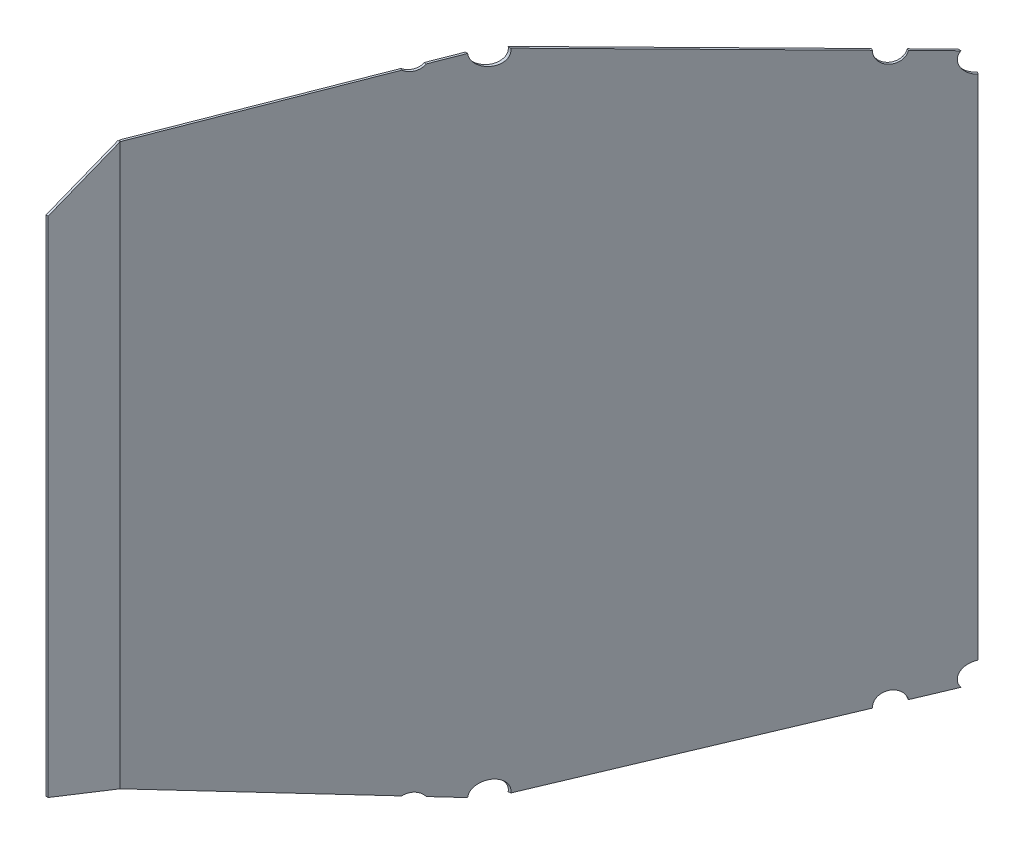
ISO-10303-21;
HEADER;
FILE_DESCRIPTION(('STEP AP214'),'2;1');
FILE_NAME('part.step','',(''),(''),'','','');
FILE_SCHEMA(('AUTOMOTIVE_DESIGN { 1 0 10303 214 1 1 1 1 }'));
ENDSEC;
DATA;
#1=APPLICATION_CONTEXT('core data for automotive mechanical design processes');
#2=APPLICATION_PROTOCOL_DEFINITION('international standard','automotive_design',2000,#1);
#3=PRODUCT_CONTEXT('',#1,'mechanical');
#4=PRODUCT('Part','Part','',(#3));
#5=PRODUCT_RELATED_PRODUCT_CATEGORY('part','',(#4));
#6=PRODUCT_DEFINITION_FORMATION('','',#4);
#7=PRODUCT_DEFINITION_CONTEXT('part definition',#1,'design');
#8=PRODUCT_DEFINITION('design','',#6,#7);
#9=PRODUCT_DEFINITION_SHAPE('','',#8);
#10=(LENGTH_UNIT() NAMED_UNIT(*) SI_UNIT(.MILLI.,.METRE.));
#11=(NAMED_UNIT(*) PLANE_ANGLE_UNIT() SI_UNIT($,.RADIAN.));
#12=(NAMED_UNIT(*) SI_UNIT($,.STERADIAN.) SOLID_ANGLE_UNIT());
#13=UNCERTAINTY_MEASURE_WITH_UNIT(LENGTH_MEASURE(1.E-05),#10,'distance_accuracy_value','');
#14=(GEOMETRIC_REPRESENTATION_CONTEXT(3) GLOBAL_UNCERTAINTY_ASSIGNED_CONTEXT((#13)) GLOBAL_UNIT_ASSIGNED_CONTEXT((#10,
#11,#12)) REPRESENTATION_CONTEXT('',''));
#15=CARTESIAN_POINT('',(0.,0.,0.));
#16=DIRECTION('',(0.,0.,1.));
#17=DIRECTION('',(1.,0.,0.));
#18=AXIS2_PLACEMENT_3D('',#15,#16,#17);
#19=CARTESIAN_POINT('',(10.5410000000001,0.,525.07591607291));
#20=DIRECTION('',(0.,0.,-1.));
#21=DIRECTION('',(-1.,0.,0.));
#22=AXIS2_PLACEMENT_3D('',#19,#20,#21);
#23=PLANE('',#22);
#24=DIRECTION('',(0.,1.,0.));
#25=VECTOR('',#24,1.);
#26=CARTESIAN_POINT('',(12.7000000000001,0.,525.07591607291));
#27=LINE('',#26,#25);
#28=CARTESIAN_POINT('',(12.7000000000001,-279.4,525.07591607291));
#29=VERTEX_POINT('',#28);
#30=CARTESIAN_POINT('',(12.7000000000001,279.4,525.07591607291));
#31=VERTEX_POINT('',#30);
#32=EDGE_CURVE('E122',#29,#31,#27,.T.);
#33=ORIENTED_EDGE('',*,*,#32,.F.);
#34=DIRECTION('',(1.,0.,0.));
#35=VECTOR('',#34,1.);
#36=CARTESIAN_POINT('',(10.5410000000001,-279.4,525.07591607291));
#37=LINE('',#36,#35);
#38=CARTESIAN_POINT('',(10.5410000000001,-279.4,525.07591607291));
#39=VERTEX_POINT('',#38);
#40=EDGE_CURVE('E12',#39,#29,#37,.T.);
#41=ORIENTED_EDGE('',*,*,#40,.F.);
#42=DIRECTION('',(0.,1.,0.));
#43=VECTOR('',#42,1.);
#44=CARTESIAN_POINT('',(10.5410000000001,0.,525.07591607291));
#45=LINE('',#44,#43);
#46=CARTESIAN_POINT('',(10.5410000000001,279.4,525.07591607291));
#47=VERTEX_POINT('',#46);
#48=EDGE_CURVE('E107',#39,#47,#45,.T.);
#49=ORIENTED_EDGE('',*,*,#48,.T.);
#50=DIRECTION('',(1.,0.,0.));
#51=VECTOR('',#50,1.);
#52=CARTESIAN_POINT('',(10.5410000000001,279.4,525.07591607291));
#53=LINE('',#52,#51);
#54=EDGE_CURVE('E75',#47,#31,#53,.T.);
#55=ORIENTED_EDGE('',*,*,#54,.T.);
#56=EDGE_LOOP('',(#33,#41,#49,#55));
#57=FACE_BOUND('',#56,.T.);
#58=ADVANCED_FACE('F59',(#57),#23,.T.);
#59=CARTESIAN_POINT('',(10.5410000000001,-421.142218376144,166.451813741526));
#60=DIRECTION('',(0.,0.929995652978715,-0.367570517643477));
#61=DIRECTION('',(0.,0.367570517643477,0.929995652978715));
#62=AXIS2_PLACEMENT_3D('',#59,#60,#61);
#63=PLANE('',#62);
#64=DIRECTION('',(0.,0.367570517643477,0.929995652978715));
#65=VECTOR('',#64,1.);
#66=CARTESIAN_POINT('',(12.7000000000001,-421.142218376144,166.451813741526));
#67=LINE('',#66,#65);
#68=CARTESIAN_POINT('',(12.7000000000001,-251.012323537438,596.9));
#69=VERTEX_POINT('',#68);
#70=EDGE_CURVE('E113',#29,#69,#67,.T.);
#71=ORIENTED_EDGE('',*,*,#70,.T.);
#72=DIRECTION('',(1.,0.,0.));
#73=VECTOR('',#72,1.);
#74=CARTESIAN_POINT('',(10.5410000000001,-251.012323537438,596.9));
#75=LINE('',#74,#73);
#76=CARTESIAN_POINT('',(10.5410000000001,-251.012323537438,596.9));
#77=VERTEX_POINT('',#76);
#78=EDGE_CURVE('E67',#77,#69,#75,.T.);
#79=ORIENTED_EDGE('',*,*,#78,.F.);
#80=DIRECTION('',(0.,0.367570517643477,0.929995652978715));
#81=VECTOR('',#80,1.);
#82=CARTESIAN_POINT('',(10.5410000000001,-421.142218376144,166.451813741526));
#83=LINE('',#82,#81);
#84=EDGE_CURVE('E101',#39,#77,#83,.T.);
#85=ORIENTED_EDGE('',*,*,#84,.F.);
#86=ORIENTED_EDGE('',*,*,#40,.T.);
#87=EDGE_LOOP('',(#71,#79,#85,#86));
#88=FACE_BOUND('',#87,.T.);
#89=ADVANCED_FACE('F111',(#88),#63,.F.);
#90=CARTESIAN_POINT('',(10.5410000000001,0.,596.9));
#91=DIRECTION('',(0.,0.,1.));
#92=DIRECTION('',(1.,0.,0.));
#93=AXIS2_PLACEMENT_3D('',#90,#91,#92);
#94=PLANE('',#93);
#95=DIRECTION('',(0.,-1.,0.));
#96=VECTOR('',#95,1.);
#97=CARTESIAN_POINT('',(12.7000000000001,0.,596.9));
#98=LINE('',#97,#96);
#99=CARTESIAN_POINT('',(12.7000000000001,251.012323537438,596.9));
#100=VERTEX_POINT('',#99);
#101=EDGE_CURVE('E125',#100,#69,#98,.T.);
#102=ORIENTED_EDGE('',*,*,#101,.F.);
#103=DIRECTION('',(1.,0.,0.));
#104=VECTOR('',#103,1.);
#105=CARTESIAN_POINT('',(10.5410000000001,251.012323537438,596.9));
#106=LINE('',#105,#104);
#107=CARTESIAN_POINT('',(10.5410000000001,251.012323537438,596.9));
#108=VERTEX_POINT('',#107);
#109=EDGE_CURVE('E88',#108,#100,#106,.T.);
#110=ORIENTED_EDGE('',*,*,#109,.F.);
#111=DIRECTION('',(0.,-1.,0.));
#112=VECTOR('',#111,1.);
#113=CARTESIAN_POINT('',(10.5410000000001,0.,596.9));
#114=LINE('',#113,#112);
#115=EDGE_CURVE('E106',#108,#77,#114,.T.);
#116=ORIENTED_EDGE('',*,*,#115,.T.);
#117=ORIENTED_EDGE('',*,*,#78,.T.);
#118=EDGE_LOOP('',(#102,#110,#116,#117));
#119=FACE_BOUND('',#118,.T.);
#120=ADVANCED_FACE('F116',(#119),#94,.T.);
#121=CARTESIAN_POINT('',(10.5410000000001,421.142218376144,166.451813741526));
#122=DIRECTION('',(0.,0.929995652978715,0.367570517643477));
#123=DIRECTION('',(0.,-0.367570517643477,0.929995652978715));
#124=AXIS2_PLACEMENT_3D('',#121,#122,#123);
#125=PLANE('',#124);
#126=DIRECTION('',(0.,-0.367570517643477,0.929995652978715));
#127=VECTOR('',#126,1.);
#128=CARTESIAN_POINT('',(12.7000000000001,421.142218376144,166.451813741526));
#129=LINE('',#128,#127);
#130=EDGE_CURVE('E127',#31,#100,#129,.T.);
#131=ORIENTED_EDGE('',*,*,#130,.F.);
#132=ORIENTED_EDGE('',*,*,#54,.F.);
#133=DIRECTION('',(0.,-0.367570517643477,0.929995652978715));
#134=VECTOR('',#133,1.);
#135=CARTESIAN_POINT('',(10.5410000000001,421.142218376144,166.451813741526));
#136=LINE('',#135,#134);
#137=EDGE_CURVE('E117',#47,#108,#136,.T.);
#138=ORIENTED_EDGE('',*,*,#137,.T.);
#139=ORIENTED_EDGE('',*,*,#109,.T.);
#140=EDGE_LOOP('',(#131,#132,#138,#139));
#141=FACE_BOUND('',#140,.T.);
#142=ADVANCED_FACE('F132',(#141),#125,.T.);
#143=CARTESIAN_POINT('',(10.5410000000001,0.,0.));
#144=DIRECTION('',(-1.,0.,0.));
#145=DIRECTION('',(0.,0.,1.));
#146=AXIS2_PLACEMENT_3D('',#143,#144,#145);
#147=PLANE('',#146);
#148=ORIENTED_EDGE('',*,*,#48,.F.);
#149=ORIENTED_EDGE('',*,*,#84,.T.);
#150=ORIENTED_EDGE('',*,*,#115,.F.);
#151=ORIENTED_EDGE('',*,*,#137,.F.);
#152=EDGE_LOOP('',(#148,#149,#150,#151));
#153=FACE_BOUND('',#152,.T.);
#154=ADVANCED_FACE('F103',(#153),#147,.T.);
#155=CARTESIAN_POINT('',(12.7000000000001,0.,0.));
#156=DIRECTION('',(-1.,0.,0.));
#157=DIRECTION('',(0.,0.,1.));
#158=AXIS2_PLACEMENT_3D('',#155,#156,#157);
#159=PLANE('',#158);
#160=ORIENTED_EDGE('',*,*,#32,.T.);
#161=ORIENTED_EDGE('',*,*,#130,.T.);
#162=ORIENTED_EDGE('',*,*,#101,.T.);
#163=ORIENTED_EDGE('',*,*,#70,.F.);
#164=EDGE_LOOP('',(#160,#161,#162,#163));
#165=FACE_BOUND('',#164,.T.);
#166=ADVANCED_FACE('F139',(#165),#159,.F.);
#167=CLOSED_SHELL('',(#58,#89,#120,#142,#154,#166));
#168=MANIFOLD_SOLID_BREP('B2',#167);
#169=CARTESIAN_POINT('',(217.78075440518,-341.812437501323,214.772548142192));
#170=DIRECTION('',(-0.0920442080609493,-0.986211904406888,0.137527973040296));
#171=DIRECTION('',(0.,-0.138114278991666,-0.990416299309847));
#172=AXIS2_PLACEMENT_3D('',#169,#170,#171);
#173=PLANE('',#172);
#174=CARTESIAN_POINT('',(180.084004303636,-316.675903331611,369.796877031891));
#175=DIRECTION('',(-0.0920442080609493,-0.986211904406888,0.137527973040296));
#176=DIRECTION('',(0.929484119287357,-0.0355511155803089,0.36714491712892));
#177=AXIS2_PLACEMENT_3D('',#174,#175,#176);
#178=ELLIPSE('',#177,73.4026636446802,12.954);
#179=CARTESIAN_POINT('',(125.171787956182,-313.331789130021,357.026047996591));
#180=VERTEX_POINT('',#179);
#181=CARTESIAN_POINT('',(123.373881738882,-313.330680840839,355.830699571687));
#182=VERTEX_POINT('',#181);
#183=EDGE_CURVE('E313',#180,#182,#178,.T.);
#184=ORIENTED_EDGE('',*,*,#183,.F.);
#185=DIRECTION('',(0.548531753129779,-0.165487400143152,-0.819589431485199));
#186=VECTOR('',#185,1.);
#187=CARTESIAN_POINT('',(219.574987038825,-341.812437501323,215.973385456886));
#188=LINE('',#187,#186);
#189=CARTESIAN_POINT('',(12.7000000000003,-279.4,525.07591607291));
#190=VERTEX_POINT('',#189);
#191=EDGE_CURVE('E321',#190,#180,#188,.T.);
#192=ORIENTED_EDGE('',*,*,#191,.F.);
#193=DIRECTION('',(0.831048000762172,0.,0.55620070157201));
#194=VECTOR('',#193,1.);
#195=CARTESIAN_POINT('',(10.9057673663548,-279.4,523.875078758216));
#196=LINE('',#195,#194);
#197=CARTESIAN_POINT('',(10.9057673663548,-279.4,523.875078758216));
#198=VERTEX_POINT('',#197);
#199=EDGE_CURVE('E349',#198,#190,#196,.T.);
#200=ORIENTED_EDGE('',*,*,#199,.F.);
#201=DIRECTION('',(0.548531753129779,-0.165487400143152,-0.819589431485199));
#202=VECTOR('',#201,1.);
#203=CARTESIAN_POINT('',(217.78075440518,-341.812437501323,214.772548142192));
#204=LINE('',#203,#202);
#205=EDGE_CURVE('E323',#198,#182,#204,.T.);
#206=ORIENTED_EDGE('',*,*,#205,.T.);
#207=EDGE_LOOP('',(#184,#192,#200,#206));
#208=FACE_BOUND('',#207,.T.);
#209=ADVANCED_FACE('F189',(#208),#173,.T.);
#210=CARTESIAN_POINT('',(273.305054320382,-293.960977005014,131.810843297464));
#211=DIRECTION('',(-0.0795337615759115,0.989723451821371,0.118835473173525));
#212=DIRECTION('',(0.,-0.1192131197344,0.992868688237871));
#213=AXIS2_PLACEMENT_3D('',#210,#211,#212);
#214=PLANE('',#213);
#215=DIRECTION('',(-0.550484878265318,-0.142994716387668,0.822507695943587));
#216=VECTOR('',#215,1.);
#217=CARTESIAN_POINT('',(275.099286954028,-293.960977005014,133.011680612158));
#218=LINE('',#217,#216);
#219=CARTESIAN_POINT('',(348.785125813966,-274.820241181775,22.9138887611936));
#220=VERTEX_POINT('',#219);
#221=CARTESIAN_POINT('',(327.80523946776,-280.270005591971,54.2610131983872));
#222=VERTEX_POINT('',#221);
#223=EDGE_CURVE('E334',#220,#222,#218,.T.);
#224=ORIENTED_EDGE('',*,*,#223,.T.);
#225=CARTESIAN_POINT('',(333.441864812654,-281.820955652056,70.9505892178949));
#226=DIRECTION('',(-0.0795337615759115,0.989723451821371,0.118835473173525));
#227=DIRECTION('',(0.90767615796685,0.0226240813282437,0.419061025630624));
#228=AXIS2_PLACEMENT_3D('',#225,#226,#227);
#229=ELLIPSE('',#228,165.338648410125,12.954);
#230=CARTESIAN_POINT('',(325.81292932087,-280.321458481864,53.3561336574114));
#231=VERTEX_POINT('',#230);
#232=EDGE_CURVE('E438',#222,#231,#229,.T.);
#233=ORIENTED_EDGE('',*,*,#232,.T.);
#234=DIRECTION('',(-0.550484878265318,-0.142994716387668,0.822507695943587));
#235=VECTOR('',#234,1.);
#236=CARTESIAN_POINT('',(273.305054320382,-293.960977005014,131.810843297464));
#237=LINE('',#236,#235);
#238=CARTESIAN_POINT('',(346.192891207091,-275.027531282455,22.9053871314096));
#239=VERTEX_POINT('',#238);
#240=EDGE_CURVE('E397',#239,#231,#237,.T.);
#241=ORIENTED_EDGE('',*,*,#240,.F.);
#242=CARTESIAN_POINT('',(296.864587760411,-277.246265668834,8.36989513072368));
#243=DIRECTION('',(-0.0795337615759115,0.989723451821371,0.118835473173525));
#244=DIRECTION('',(0.995554786287447,0.072832158220692,0.0597172021202568));
#245=AXIS2_PLACEMENT_3D('',#242,#243,#244);
#246=ELLIPSE('',#245,114.450133275038,12.954);
#247=EDGE_CURVE('E433',#239,#220,#246,.T.);
#248=ORIENTED_EDGE('',*,*,#247,.T.);
#249=EDGE_LOOP('',(#224,#233,#241,#248));
#250=FACE_BOUND('',#249,.T.);
#251=ADVANCED_FACE('F465',(#250),#214,.F.);
#252=CARTESIAN_POINT('',(217.78075440518,341.812437501323,214.772548142192));
#253=DIRECTION('',(0.0920442080609493,-0.986211904406888,-0.137527973040296));
#254=DIRECTION('',(0.,0.138114278991666,-0.990416299309847));
#255=AXIS2_PLACEMENT_3D('',#252,#253,#254);
#256=PLANE('',#255);
#257=CARTESIAN_POINT('',(180.084004303636,316.675903331611,369.796877031891));
#258=DIRECTION('',(0.0920442080609493,-0.986211904406888,-0.137527973040296));
#259=DIRECTION('',(0.929484119287357,0.0355511155803089,0.36714491712892));
#260=AXIS2_PLACEMENT_3D('',#257,#258,#259);
#261=ELLIPSE('',#260,73.4026636446802,12.954);
#262=CARTESIAN_POINT('',(135.029482840484,316.305772474649,342.297160380001));
#263=VERTEX_POINT('',#262);
#264=CARTESIAN_POINT('',(132.734915399894,316.154825686373,341.843898967041));
#265=VERTEX_POINT('',#264);
#266=EDGE_CURVE('E426',#263,#265,#261,.F.);
#267=ORIENTED_EDGE('',*,*,#266,.F.);
#268=DIRECTION('',(0.548531753129779,0.165487400143152,-0.819589431485199));
#269=VECTOR('',#268,1.);
#270=CARTESIAN_POINT('',(219.574987038825,341.812437501323,215.973385456886));
#271=LINE('',#270,#269);
#272=CARTESIAN_POINT('',(151.584505427097,321.300283059566,317.561451877132));
#273=VERTEX_POINT('',#272);
#274=EDGE_CURVE('E332',#263,#273,#271,.T.);
#275=ORIENTED_EDGE('',*,*,#274,.T.);
#276=CARTESIAN_POINT('',(147.589152739267,322.730018641027,304.634835674143));
#277=DIRECTION('',(0.0920442080609493,-0.986211904406888,-0.137527973040296));
#278=DIRECTION('',(0.995554113494674,0.0883700859270627,0.0325996168241001));
#279=AXIS2_PLACEMENT_3D('',#276,#277,#278);
#280=ELLIPSE('',#279,56.5707851875169,12.954);
#281=CARTESIAN_POINT('',(149.022082967497,321.068526672833,317.508406388771));
#282=VERTEX_POINT('',#281);
#283=EDGE_CURVE('E420',#282,#273,#280,.F.);
#284=ORIENTED_EDGE('',*,*,#283,.F.);
#285=DIRECTION('',(0.548531753129779,0.165487400143152,-0.819589431485199));
#286=VECTOR('',#285,1.);
#287=CARTESIAN_POINT('',(217.78075440518,341.812437501323,214.772548142192));
#288=LINE('',#287,#286);
#289=EDGE_CURVE('E392',#265,#282,#288,.T.);
#290=ORIENTED_EDGE('',*,*,#289,.F.);
#291=EDGE_LOOP('',(#267,#275,#284,#290));
#292=FACE_BOUND('',#291,.T.);
#293=ADVANCED_FACE('F471',(#292),#256,.F.);
#294=CARTESIAN_POINT('',(273.305054320382,293.960977005014,131.810843297464));
#295=DIRECTION('',(0.0795337615759115,0.989723451821371,-0.118835473173525));
#296=DIRECTION('',(0.,0.1192131197344,0.992868688237871));
#297=AXIS2_PLACEMENT_3D('',#294,#295,#296);
#298=PLANE('',#297);
#299=DIRECTION('',(-0.550484878265318,0.142994716387668,0.822507695943587));
#300=VECTOR('',#299,1.);
#301=CARTESIAN_POINT('',(273.305054320382,293.960977005014,131.810843297464));
#302=LINE('',#301,#300);
#303=CARTESIAN_POINT('',(311.440797781742,284.05478332777,74.8302726660928));
#304=VERTEX_POINT('',#303);
#305=CARTESIAN_POINT('',(166.233377232908,321.774064526186,291.792128704522));
#306=VERTEX_POINT('',#305);
#307=EDGE_CURVE('E388',#304,#306,#302,.T.);
#308=ORIENTED_EDGE('',*,*,#307,.T.);
#309=CARTESIAN_POINT('',(113.344182062824,327.565232050473,304.626492324102));
#310=DIRECTION('',(0.0795337615759115,0.989723451821371,-0.118835473173525));
#311=DIRECTION('',(0.996697180519597,-0.0809177469176293,-0.00685919660457928));
#312=AXIS2_PLACEMENT_3D('',#309,#310,#311);
#313=ELLIPSE('',#312,217.176234772577,12.954);
#314=CARTESIAN_POINT('',(168.816536568898,321.569131830473,291.814190162088));
#315=VERTEX_POINT('',#314);
#316=EDGE_CURVE('E417',#306,#315,#313,.F.);
#317=ORIENTED_EDGE('',*,*,#316,.T.);
#318=DIRECTION('',(-0.550484878265318,0.142994716387668,0.822507695943587));
#319=VECTOR('',#318,1.);
#320=CARTESIAN_POINT('',(275.099286954028,293.960977005014,133.011680612158));
#321=LINE('',#320,#319);
#322=CARTESIAN_POINT('',(313.415431512691,284.007922088228,75.7615634469087));
#323=VERTEX_POINT('',#322);
#324=EDGE_CURVE('E341',#323,#315,#321,.T.);
#325=ORIENTED_EDGE('',*,*,#324,.F.);
#326=CARTESIAN_POINT('',(333.441864812654,281.820955652056,70.9505892178949));
#327=DIRECTION('',(0.0795337615759115,0.989723451821371,-0.118835473173525));
#328=DIRECTION('',(0.90767615796685,-0.0226240813282437,0.419061025630624));
#329=AXIS2_PLACEMENT_3D('',#326,#327,#328);
#330=ELLIPSE('',#329,165.338648410125,12.954);
#331=EDGE_CURVE('E410',#323,#304,#330,.F.);
#332=ORIENTED_EDGE('',*,*,#331,.T.);
#333=EDGE_LOOP('',(#308,#317,#325,#332));
#334=FACE_BOUND('',#333,.T.);
#335=ADVANCED_FACE('F486',(#334),#298,.T.);
#336=CARTESIAN_POINT('',(353.805767366355,0.,11.5305983288704));
#337=DIRECTION('',(0.55620070157201,0.,-0.831048000762172));
#338=DIRECTION('',(-0.831048000762172,0.,-0.55620070157201));
#339=AXIS2_PLACEMENT_3D('',#336,#337,#338);
#340=PLANE('',#339);
#341=CARTESIAN_POINT('',(355.6,-266.19702970297,12.7314356435645));
#342=DIRECTION('',(0.55620070157201,0.,-0.831048000762172));
#343=DIRECTION('',(0.812373648709568,0.210800270497735,0.543702400988247));
#344=AXIS2_PLACEMENT_3D('',#341,#342,#343);
#345=ELLIPSE('',#344,26.7271202105621,12.954);
#346=CARTESIAN_POINT('',(353.805767366355,-253.413996600512,11.5305983288704));
#347=VERTEX_POINT('',#346);
#348=CARTESIAN_POINT('',(355.6,-253.0170453242,12.7314356435644));
#349=VERTEX_POINT('',#348);
#350=EDGE_CURVE('E431',#347,#349,#345,.T.);
#351=ORIENTED_EDGE('',*,*,#350,.F.);
#352=DIRECTION('',(0.,1.,0.));
#353=VECTOR('',#352,1.);
#354=CARTESIAN_POINT('',(353.805767366355,0.,11.5305983288704));
#355=LINE('',#354,#353);
#356=CARTESIAN_POINT('',(353.805767366355,253.413996600512,11.5305983288704));
#357=VERTEX_POINT('',#356);
#358=EDGE_CURVE('E345',#347,#357,#355,.T.);
#359=ORIENTED_EDGE('',*,*,#358,.T.);
#360=CARTESIAN_POINT('',(355.6,266.19702970297,12.7314356435645));
#361=DIRECTION('',(0.55620070157201,0.,-0.831048000762172));
#362=DIRECTION('',(0.812373648709568,-0.210800270497735,0.543702400988247));
#363=AXIS2_PLACEMENT_3D('',#360,#361,#362);
#364=ELLIPSE('',#363,26.7271202105621,12.954);
#365=CARTESIAN_POINT('',(355.6,253.0170453242,12.7314356435644));
#366=VERTEX_POINT('',#365);
#367=EDGE_CURVE('E383',#357,#366,#364,.F.);
#368=ORIENTED_EDGE('',*,*,#367,.T.);
#369=DIRECTION('',(0.,1.,0.));
#370=VECTOR('',#369,1.);
#371=CARTESIAN_POINT('',(355.6,0.,12.7314356435644));
#372=LINE('',#371,#370);
#373=EDGE_CURVE('E377',#349,#366,#372,.T.);
#374=ORIENTED_EDGE('',*,*,#373,.F.);
#375=EDGE_LOOP('',(#351,#359,#368,#374));
#376=FACE_BOUND('',#375,.T.);
#377=ADVANCED_FACE('F191',(#376),#340,.T.);
#378=CARTESIAN_POINT('',(313.415431512691,-284.007922088228,75.7615634469087));
#379=VERTEX_POINT('',#378);
#380=CARTESIAN_POINT('',(168.816536568898,-321.569131830473,291.814190162088));
#381=VERTEX_POINT('',#380);
#382=EDGE_CURVE('E368',#379,#381,#218,.T.);
#383=ORIENTED_EDGE('',*,*,#382,.T.);
#384=CARTESIAN_POINT('',(113.344182062824,-327.565232050473,304.626492324102));
#385=DIRECTION('',(-0.0795337615759115,0.989723451821371,0.118835473173525));
#386=DIRECTION('',(0.996697180519597,0.0809177469176293,-0.00685919660457928));
#387=AXIS2_PLACEMENT_3D('',#384,#385,#386);
#388=ELLIPSE('',#387,217.176234772577,12.954);
#389=CARTESIAN_POINT('',(166.233377232908,-321.774064526186,291.792128704522));
#390=VERTEX_POINT('',#389);
#391=EDGE_CURVE('E211',#381,#390,#388,.T.);
#392=ORIENTED_EDGE('',*,*,#391,.T.);
#393=CARTESIAN_POINT('',(311.440797781742,-284.05478332777,74.8302726660928));
#394=VERTEX_POINT('',#393);
#395=EDGE_CURVE('E400',#394,#390,#237,.T.);
#396=ORIENTED_EDGE('',*,*,#395,.F.);
#397=EDGE_CURVE('E376',#394,#379,#229,.T.);
#398=ORIENTED_EDGE('',*,*,#397,.T.);
#399=EDGE_LOOP('',(#383,#392,#396,#398));
#400=FACE_BOUND('',#399,.T.);
#401=ADVANCED_FACE('F373',(#400),#214,.F.);
#402=CARTESIAN_POINT('',(132.734915399894,-316.154825686373,341.843898967041));
#403=VERTEX_POINT('',#402);
#404=CARTESIAN_POINT('',(135.029482840484,-316.305772474649,342.297160380001));
#405=VERTEX_POINT('',#404);
#406=EDGE_CURVE('E204',#403,#405,#178,.T.);
#407=ORIENTED_EDGE('',*,*,#406,.F.);
#408=CARTESIAN_POINT('',(149.022082967497,-321.068526672833,317.508406388771));
#409=VERTEX_POINT('',#408);
#410=EDGE_CURVE('E396',#403,#409,#204,.T.);
#411=ORIENTED_EDGE('',*,*,#410,.T.);
#412=CARTESIAN_POINT('',(147.589152739267,-322.730018641027,304.634835674143));
#413=DIRECTION('',(-0.0920442080609493,-0.986211904406888,0.137527973040296));
#414=DIRECTION('',(0.995554113494674,-0.0883700859270627,0.0325996168241001));
#415=AXIS2_PLACEMENT_3D('',#412,#413,#414);
#416=ELLIPSE('',#415,56.5707851875169,12.954);
#417=CARTESIAN_POINT('',(151.584505427097,-321.300283059566,317.561451877132));
#418=VERTEX_POINT('',#417);
#419=EDGE_CURVE('E443',#418,#409,#416,.T.);
#420=ORIENTED_EDGE('',*,*,#419,.F.);
#421=EDGE_CURVE('E330',#405,#418,#188,.T.);
#422=ORIENTED_EDGE('',*,*,#421,.F.);
#423=EDGE_LOOP('',(#407,#411,#420,#422));
#424=FACE_BOUND('',#423,.T.);
#425=ADVANCED_FACE('F448',(#424),#173,.T.);
#426=CARTESIAN_POINT('',(10.9057673663548,0.,523.875078758216));
#427=DIRECTION('',(0.55620070157201,0.,-0.831048000762172));
#428=DIRECTION('',(-0.831048000762172,0.,-0.55620070157201));
#429=AXIS2_PLACEMENT_3D('',#426,#427,#428);
#430=PLANE('',#429);
#431=DIRECTION('',(0.,1.,0.));
#432=VECTOR('',#431,1.);
#433=CARTESIAN_POINT('',(12.7000000000003,0.,525.07591607291));
#434=LINE('',#433,#432);
#435=CARTESIAN_POINT('',(12.7000000000003,279.4,525.07591607291));
#436=VERTEX_POINT('',#435);
#437=EDGE_CURVE('E329',#190,#436,#434,.T.);
#438=ORIENTED_EDGE('',*,*,#437,.T.);
#439=DIRECTION('',(0.831048000762172,0.,0.55620070157201));
#440=VECTOR('',#439,1.);
#441=CARTESIAN_POINT('',(10.9057673663548,279.4,523.875078758216));
#442=LINE('',#441,#440);
#443=CARTESIAN_POINT('',(10.9057673663548,279.4,523.875078758216));
#444=VERTEX_POINT('',#443);
#445=EDGE_CURVE('E346',#444,#436,#442,.T.);
#446=ORIENTED_EDGE('',*,*,#445,.F.);
#447=DIRECTION('',(0.,1.,0.));
#448=VECTOR('',#447,1.);
#449=CARTESIAN_POINT('',(10.9057673663548,0.,523.875078758216));
#450=LINE('',#449,#448);
#451=EDGE_CURVE('E393',#198,#444,#450,.T.);
#452=ORIENTED_EDGE('',*,*,#451,.F.);
#453=ORIENTED_EDGE('',*,*,#199,.T.);
#454=EDGE_LOOP('',(#438,#446,#452,#453));
#455=FACE_BOUND('',#454,.T.);
#456=ADVANCED_FACE('F475',(#455),#430,.F.);
#457=CARTESIAN_POINT('',(123.373881738882,313.330680840839,355.830699571687));
#458=VERTEX_POINT('',#457);
#459=CARTESIAN_POINT('',(125.171787956182,313.331789130021,357.026047996591));
#460=VERTEX_POINT('',#459);
#461=EDGE_CURVE('E427',#458,#460,#261,.F.);
#462=ORIENTED_EDGE('',*,*,#461,.F.);
#463=EDGE_CURVE('E389',#444,#458,#288,.T.);
#464=ORIENTED_EDGE('',*,*,#463,.F.);
#465=ORIENTED_EDGE('',*,*,#445,.T.);
#466=EDGE_CURVE('E338',#436,#460,#271,.T.);
#467=ORIENTED_EDGE('',*,*,#466,.T.);
#468=EDGE_LOOP('',(#462,#464,#465,#467));
#469=FACE_BOUND('',#468,.T.);
#470=ADVANCED_FACE('F481',(#469),#256,.F.);
#471=CARTESIAN_POINT('',(346.192891207091,275.027531282455,22.9053871314096));
#472=VERTEX_POINT('',#471);
#473=CARTESIAN_POINT('',(325.81292932087,280.321458481864,53.3561336574114));
#474=VERTEX_POINT('',#473);
#475=EDGE_CURVE('E350',#472,#474,#302,.T.);
#476=ORIENTED_EDGE('',*,*,#475,.T.);
#477=CARTESIAN_POINT('',(327.80523946776,280.270005591971,54.2610131983872));
#478=VERTEX_POINT('',#477);
#479=EDGE_CURVE('E411',#474,#478,#330,.F.);
#480=ORIENTED_EDGE('',*,*,#479,.T.);
#481=CARTESIAN_POINT('',(348.785125813966,274.820241181775,22.9138887611936));
#482=VERTEX_POINT('',#481);
#483=EDGE_CURVE('E342',#482,#478,#321,.T.);
#484=ORIENTED_EDGE('',*,*,#483,.F.);
#485=CARTESIAN_POINT('',(296.864587760411,277.246265668834,8.36989513072368));
#486=DIRECTION('',(0.0795337615759115,0.989723451821371,-0.118835473173525));
#487=DIRECTION('',(0.995554786287447,-0.072832158220692,0.0597172021202568));
#488=AXIS2_PLACEMENT_3D('',#485,#486,#487);
#489=ELLIPSE('',#488,114.450133275038,12.954);
#490=EDGE_CURVE('E404',#482,#472,#489,.F.);
#491=ORIENTED_EDGE('',*,*,#490,.T.);
#492=EDGE_LOOP('',(#476,#480,#484,#491));
#493=FACE_BOUND('',#492,.T.);
#494=ADVANCED_FACE('F493',(#493),#298,.T.);
#495=CARTESIAN_POINT('',(249.682473472456,0.,167.10655315728));
#496=DIRECTION('',(-0.831048000762173,0.,-0.55620070157201));
#497=DIRECTION('',(-0.55620070157201,0.,0.831048000762173));
#498=AXIS2_PLACEMENT_3D('',#495,#496,#497);
#499=PLANE('',#498);
#500=CARTESIAN_POINT('',(126.910839100546,-324.616547019948,350.545950135226));
#501=DIRECTION('',(-0.831048000762173,0.,-0.55620070157201));
#502=DIRECTION('',(0.480110672976889,0.50486756882654,-0.717357985695327));
#503=AXIS2_PLACEMENT_3D('',#500,#501,#502);
#504=ELLIPSE('',#503,13.4751779576768,12.954);
#505=EDGE_CURVE('E324',#182,#403,#504,.T.);
#506=ORIENTED_EDGE('',*,*,#505,.F.);
#507=ORIENTED_EDGE('',*,*,#205,.F.);
#508=ORIENTED_EDGE('',*,*,#451,.T.);
#509=ORIENTED_EDGE('',*,*,#463,.T.);
#510=CARTESIAN_POINT('',(126.910839100546,324.616547019948,350.545950135226));
#511=DIRECTION('',(-0.831048000762173,0.,-0.55620070157201));
#512=DIRECTION('',(0.480110672976889,-0.50486756882654,-0.717357985695327));
#513=AXIS2_PLACEMENT_3D('',#510,#511,#512);
#514=ELLIPSE('',#513,13.4751779576768,12.954);
#515=EDGE_CURVE('E423',#458,#265,#514,.F.);
#516=ORIENTED_EDGE('',*,*,#515,.T.);
#517=ORIENTED_EDGE('',*,*,#289,.T.);
#518=CARTESIAN_POINT('',(157.636419972562,321.311396277069,304.637283562573));
#519=DIRECTION('',(-0.831048000762173,0.,-0.55620070157201));
#520=DIRECTION('',(0.539089390238009,-0.246135747929268,-0.805481112704768));
#521=AXIS2_PLACEMENT_3D('',#518,#519,#520);
#522=ELLIPSE('',#521,15.7395910080123,12.954);
#523=EDGE_CURVE('E414',#282,#306,#522,.F.);
#524=ORIENTED_EDGE('',*,*,#523,.T.);
#525=ORIENTED_EDGE('',*,*,#307,.F.);
#526=CARTESIAN_POINT('',(318.719991779222,283.460768242413,63.9540554990364));
#527=DIRECTION('',(-0.831048000762173,0.,-0.55620070157201));
#528=DIRECTION('',(0.45763108226935,-0.568359283952727,-0.683770076038523));
#529=AXIS2_PLACEMENT_3D('',#526,#527,#528);
#530=ELLIPSE('',#529,13.1596957943614,12.954);
#531=EDGE_CURVE('E407',#304,#474,#530,.F.);
#532=ORIENTED_EDGE('',*,*,#531,.T.);
#533=ORIENTED_EDGE('',*,*,#475,.F.);
#534=CARTESIAN_POINT('',(353.125076038074,266.662609458184,12.5476541612432));
#535=DIRECTION('',(-0.831048000762173,0.,-0.55620070157201));
#536=DIRECTION('',(0.51985292328741,-0.355569384705911,-0.776738920622235));
#537=AXIS2_PLACEMENT_3D('',#534,#535,#536);
#538=ELLIPSE('',#537,15.1501945639283,12.954);
#539=EDGE_CURVE('E379',#472,#357,#538,.F.);
#540=ORIENTED_EDGE('',*,*,#539,.T.);
#541=ORIENTED_EDGE('',*,*,#358,.F.);
#542=CARTESIAN_POINT('',(353.125076038074,-266.662609458184,12.5476541612432));
#543=DIRECTION('',(-0.831048000762173,0.,-0.55620070157201));
#544=DIRECTION('',(0.51985292328741,0.355569384705911,-0.776738920622235));
#545=AXIS2_PLACEMENT_3D('',#542,#543,#544);
#546=ELLIPSE('',#545,15.1501945639283,12.954);
#547=EDGE_CURVE('E429',#239,#347,#546,.T.);
#548=ORIENTED_EDGE('',*,*,#547,.F.);
#549=ORIENTED_EDGE('',*,*,#240,.T.);
#550=CARTESIAN_POINT('',(318.719991779222,-283.460768242413,63.9540554990364));
#551=DIRECTION('',(-0.831048000762173,0.,-0.55620070157201));
#552=DIRECTION('',(0.45763108226935,0.568359283952727,-0.683770076038523));
#553=AXIS2_PLACEMENT_3D('',#550,#551,#552);
#554=ELLIPSE('',#553,13.1596957943614,12.954);
#555=EDGE_CURVE('E436',#394,#231,#554,.T.);
#556=ORIENTED_EDGE('',*,*,#555,.F.);
#557=ORIENTED_EDGE('',*,*,#395,.T.);
#558=CARTESIAN_POINT('',(157.636419972562,-321.311396277069,304.637283562573));
#559=DIRECTION('',(-0.831048000762173,0.,-0.55620070157201));
#560=DIRECTION('',(0.539089390238009,0.246135747929268,-0.805481112704769));
#561=AXIS2_PLACEMENT_3D('',#558,#559,#560);
#562=ELLIPSE('',#561,15.7395910080123,12.954);
#563=EDGE_CURVE('E440',#409,#390,#562,.T.);
#564=ORIENTED_EDGE('',*,*,#563,.F.);
#565=ORIENTED_EDGE('',*,*,#410,.F.);
#566=EDGE_LOOP('',(#506,#507,#508,#509,#516,#517,#524,#525,#532,#533,#540,#541,#548,#549,#556,
#557,#564,#565));
#567=FACE_BOUND('',#566,.T.);
#568=ADVANCED_FACE('F450',(#567),#499,.T.);
#569=CARTESIAN_POINT('',(251.476706106102,0.,168.307390471974));
#570=DIRECTION('',(-0.831048000762173,0.,-0.55620070157201));
#571=DIRECTION('',(-0.55620070157201,0.,0.831048000762173));
#572=AXIS2_PLACEMENT_3D('',#569,#570,#571);
#573=PLANE('',#572);
#574=ORIENTED_EDGE('',*,*,#191,.T.);
#575=CARTESIAN_POINT('',(129.002050198817,-324.304254867599,351.303056691222));
#576=DIRECTION('',(-0.831048000762173,0.,-0.55620070157201));
#577=DIRECTION('',(0.480110672976889,0.50486756882654,-0.717357985695327));
#578=AXIS2_PLACEMENT_3D('',#575,#576,#577);
#579=ELLIPSE('',#578,13.4751779576768,12.954);
#580=EDGE_CURVE('E57',#180,#405,#579,.T.);
#581=ORIENTED_EDGE('',*,*,#580,.T.);
#582=ORIENTED_EDGE('',*,*,#421,.T.);
#583=CARTESIAN_POINT('',(160.233920968338,-320.944642520306,304.637916410539));
#584=DIRECTION('',(-0.831048000762173,0.,-0.55620070157201));
#585=DIRECTION('',(0.539089390238009,0.246135747929268,-0.805481112704769));
#586=AXIS2_PLACEMENT_3D('',#583,#584,#585);
#587=ELLIPSE('',#586,15.7395910080123,12.954);
#588=EDGE_CURVE('E197',#418,#381,#587,.T.);
#589=ORIENTED_EDGE('',*,*,#588,.T.);
#590=ORIENTED_EDGE('',*,*,#382,.F.);
#591=CARTESIAN_POINT('',(320.690995462248,-283.241225752967,64.8907701206723));
#592=DIRECTION('',(-0.831048000762173,0.,-0.55620070157201));
#593=DIRECTION('',(0.45763108226935,0.568359283952727,-0.683770076038523));
#594=AXIS2_PLACEMENT_3D('',#591,#592,#593);
#595=ELLIPSE('',#594,13.1596957943614,12.954);
#596=EDGE_CURVE('E364',#379,#222,#595,.T.);
#597=ORIENTED_EDGE('',*,*,#596,.T.);
#598=ORIENTED_EDGE('',*,*,#223,.F.);
#599=CARTESIAN_POINT('',(355.6,-266.19702970297,12.7314356435645));
#600=DIRECTION('',(-0.831048000762173,0.,-0.55620070157201));
#601=DIRECTION('',(0.51985292328741,0.355569384705911,-0.776738920622235));
#602=AXIS2_PLACEMENT_3D('',#599,#600,#601);
#603=ELLIPSE('',#602,15.1501945639283,12.954);
#604=EDGE_CURVE('E361',#220,#349,#603,.T.);
#605=ORIENTED_EDGE('',*,*,#604,.T.);
#606=ORIENTED_EDGE('',*,*,#373,.T.);
#607=CARTESIAN_POINT('',(355.6,266.19702970297,12.7314356435645));
#608=DIRECTION('',(-0.831048000762173,0.,-0.55620070157201));
#609=DIRECTION('',(0.51985292328741,-0.355569384705911,-0.776738920622235));
#610=AXIS2_PLACEMENT_3D('',#607,#608,#609);
#611=ELLIPSE('',#610,15.1501945639283,12.954);
#612=EDGE_CURVE('E352',#482,#366,#611,.F.);
#613=ORIENTED_EDGE('',*,*,#612,.F.);
#614=ORIENTED_EDGE('',*,*,#483,.T.);
#615=CARTESIAN_POINT('',(320.690995462248,283.241225752967,64.8907701206723));
#616=DIRECTION('',(-0.831048000762173,0.,-0.55620070157201));
#617=DIRECTION('',(0.45763108226935,-0.568359283952727,-0.683770076038523));
#618=AXIS2_PLACEMENT_3D('',#615,#616,#617);
#619=ELLIPSE('',#618,13.1596957943614,12.954);
#620=EDGE_CURVE('E355',#323,#478,#619,.F.);
#621=ORIENTED_EDGE('',*,*,#620,.F.);
#622=ORIENTED_EDGE('',*,*,#324,.T.);
#623=CARTESIAN_POINT('',(160.233920968338,320.944642520306,304.637916410539));
#624=DIRECTION('',(-0.831048000762173,0.,-0.55620070157201));
#625=DIRECTION('',(0.539089390238009,-0.246135747929268,-0.805481112704768));
#626=AXIS2_PLACEMENT_3D('',#623,#624,#625);
#627=ELLIPSE('',#626,15.7395910080123,12.954);
#628=EDGE_CURVE('E357',#273,#315,#627,.F.);
#629=ORIENTED_EDGE('',*,*,#628,.F.);
#630=ORIENTED_EDGE('',*,*,#274,.F.);
#631=CARTESIAN_POINT('',(129.002050198817,324.304254867599,351.303056691222));
#632=DIRECTION('',(-0.831048000762173,0.,-0.55620070157201));
#633=DIRECTION('',(0.480110672976889,-0.50486756882654,-0.717357985695327));
#634=AXIS2_PLACEMENT_3D('',#631,#632,#633);
#635=ELLIPSE('',#634,13.4751779576768,12.954);
#636=EDGE_CURVE('E359',#460,#263,#635,.F.);
#637=ORIENTED_EDGE('',*,*,#636,.F.);
#638=ORIENTED_EDGE('',*,*,#466,.F.);
#639=ORIENTED_EDGE('',*,*,#437,.F.);
#640=EDGE_LOOP('',(#574,#581,#582,#589,#590,#597,#598,#605,#606,#613,#614,#621,#622,#629,#630,
#637,#638,#639));
#641=FACE_BOUND('',#640,.T.);
#642=ADVANCED_FACE('F327',(#641),#573,.F.);
#643=CARTESIAN_POINT('',(216.171744195036,292.426107527666,2.37785229171068));
#644=DIRECTION('',(0.980155318065139,-0.184385653893442,0.0727838107474112));
#645=DIRECTION('',(0.184875992870928,0.982761856840195,0.));
#646=AXIS2_PLACEMENT_3D('',#643,#644,#645);
#647=CYLINDRICAL_SURFACE('',#646,12.954);
#648=ORIENTED_EDGE('',*,*,#490,.F.);
#649=ORIENTED_EDGE('',*,*,#612,.T.);
#650=ORIENTED_EDGE('',*,*,#367,.F.);
#651=ORIENTED_EDGE('',*,*,#539,.F.);
#652=EDGE_LOOP('',(#648,#649,#650,#651));
#653=FACE_BOUND('',#652,.T.);
#654=ADVANCED_FACE('F502',(#653),#647,.F.);
#655=CARTESIAN_POINT('',(46.0874429488324,313.828255117086,-65.6138884995647));
#656=DIRECTION('',(0.898654671274461,-0.100097673780571,0.427083408130437));
#657=DIRECTION('',(0.429239212420543,0.,-0.90319084280156));
#658=AXIS2_PLACEMENT_3D('',#655,#656,#657);
#659=CYLINDRICAL_SURFACE('',#658,12.954);
#660=ORIENTED_EDGE('',*,*,#331,.F.);
#661=ORIENTED_EDGE('',*,*,#620,.T.);
#662=ORIENTED_EDGE('',*,*,#479,.F.);
#663=ORIENTED_EDGE('',*,*,#531,.F.);
#664=EDGE_LOOP('',(#660,#661,#662,#663));
#665=FACE_BOUND('',#664,.T.);
#666=ADVANCED_FACE('F536',(#665),#659,.F.);
#667=CARTESIAN_POINT('',(12.9947335983297,341.734057114756,304.602043461729));
#668=DIRECTION('',(0.990178586389027,-0.139808114420369,0.000241244375066887));
#669=DIRECTION('',(0.139808118488705,0.990178615202655,0.));
#670=AXIS2_PLACEMENT_3D('',#667,#668,#669);
#671=CYLINDRICAL_SURFACE('',#670,12.954);
#672=ORIENTED_EDGE('',*,*,#283,.T.);
#673=ORIENTED_EDGE('',*,*,#628,.T.);
#674=ORIENTED_EDGE('',*,*,#316,.F.);
#675=ORIENTED_EDGE('',*,*,#523,.F.);
#676=EDGE_LOOP('',(#672,#673,#674,#675));
#677=FACE_BOUND('',#676,.T.);
#678=ADVANCED_FACE('F515',(#677),#671,.F.);
#679=CARTESIAN_POINT('',(-80.0323256290763,355.520517633292,275.623802454936));
#680=DIRECTION('',(0.931139212338283,-0.139052183205139,0.337111639656549));
#681=DIRECTION('',(0.340418789440352,0.,-0.940273921682381));
#682=AXIS2_PLACEMENT_3D('',#679,#680,#681);
#683=CYLINDRICAL_SURFACE('',#682,12.954);
#684=ORIENTED_EDGE('',*,*,#461,.T.);
#685=ORIENTED_EDGE('',*,*,#636,.T.);
#686=ORIENTED_EDGE('',*,*,#266,.T.);
#687=ORIENTED_EDGE('',*,*,#515,.F.);
#688=EDGE_LOOP('',(#684,#685,#686,#687));
#689=FACE_BOUND('',#688,.T.);
#690=ADVANCED_FACE('F528',(#689),#683,.F.);
#691=CARTESIAN_POINT('',(216.171744195036,-292.426107527666,2.37785229171068));
#692=DIRECTION('',(0.980155318065139,0.184385653893442,0.0727838107474112));
#693=DIRECTION('',(-0.184875992870928,0.982761856840195,0.));
#694=AXIS2_PLACEMENT_3D('',#691,#692,#693);
#695=CYLINDRICAL_SURFACE('',#694,12.954);
#696=ORIENTED_EDGE('',*,*,#547,.T.);
#697=ORIENTED_EDGE('',*,*,#350,.T.);
#698=ORIENTED_EDGE('',*,*,#604,.F.);
#699=ORIENTED_EDGE('',*,*,#247,.F.);
#700=EDGE_LOOP('',(#696,#697,#698,#699));
#701=FACE_BOUND('',#700,.T.);
#702=ADVANCED_FACE('F461',(#701),#695,.F.);
#703=CARTESIAN_POINT('',(46.3820218581467,-313.79544310986,-65.4738906020689));
#704=DIRECTION('',(0.898654671274461,0.100097673780571,0.427083408130437));
#705=DIRECTION('',(0.429239212420543,0.,-0.90319084280156));
#706=AXIS2_PLACEMENT_3D('',#703,#704,#705);
#707=CYLINDRICAL_SURFACE('',#706,12.954);
#708=ORIENTED_EDGE('',*,*,#555,.T.);
#709=ORIENTED_EDGE('',*,*,#232,.F.);
#710=ORIENTED_EDGE('',*,*,#596,.F.);
#711=ORIENTED_EDGE('',*,*,#397,.F.);
#712=EDGE_LOOP('',(#708,#709,#710,#711));
#713=FACE_BOUND('',#712,.T.);
#714=ADVANCED_FACE('F454',(#713),#707,.F.);
#715=CARTESIAN_POINT('',(13.3523710878513,-341.683560543993,304.602130595539));
#716=DIRECTION('',(0.990178586389027,0.139808114420369,0.000241244375066887));
#717=DIRECTION('',(-0.139808118488705,0.990178615202655,0.));
#718=AXIS2_PLACEMENT_3D('',#715,#716,#717);
#719=CYLINDRICAL_SURFACE('',#718,12.954);
#720=ORIENTED_EDGE('',*,*,#563,.T.);
#721=ORIENTED_EDGE('',*,*,#391,.F.);
#722=ORIENTED_EDGE('',*,*,#588,.F.);
#723=ORIENTED_EDGE('',*,*,#419,.T.);
#724=EDGE_LOOP('',(#720,#721,#722,#723));
#725=FACE_BOUND('',#724,.T.);
#726=ADVANCED_FACE('F452',(#725),#719,.F.);
#727=CARTESIAN_POINT('',(-79.7160649421984,-355.47328867076,275.738302153047));
#728=DIRECTION('',(0.931139212338283,0.139052183205139,0.337111639656549));
#729=DIRECTION('',(0.340418789440352,0.,-0.940273921682381));
#730=AXIS2_PLACEMENT_3D('',#727,#728,#729);
#731=CYLINDRICAL_SURFACE('',#730,12.954);
#732=ORIENTED_EDGE('',*,*,#505,.T.);
#733=ORIENTED_EDGE('',*,*,#406,.T.);
#734=ORIENTED_EDGE('',*,*,#580,.F.);
#735=ORIENTED_EDGE('',*,*,#183,.T.);
#736=EDGE_LOOP('',(#732,#733,#734,#735));
#737=FACE_BOUND('',#736,.T.);
#738=ADVANCED_FACE('F312',(#737),#731,.F.);
#739=CLOSED_SHELL('',(#209,#251,#293,#335,#377,#401,#425,#456,#470,#494,#568,#642,#654,#666,
#678,#690,#702,#714,#726,#738));
#740=MANIFOLD_SOLID_BREP('B6',#739);
#741=ADVANCED_BREP_SHAPE_REPRESENTATION('',(#18,#168,#740),#14);
#742=SHAPE_DEFINITION_REPRESENTATION(#9,#741);
ENDSEC;
END-ISO-10303-21;
